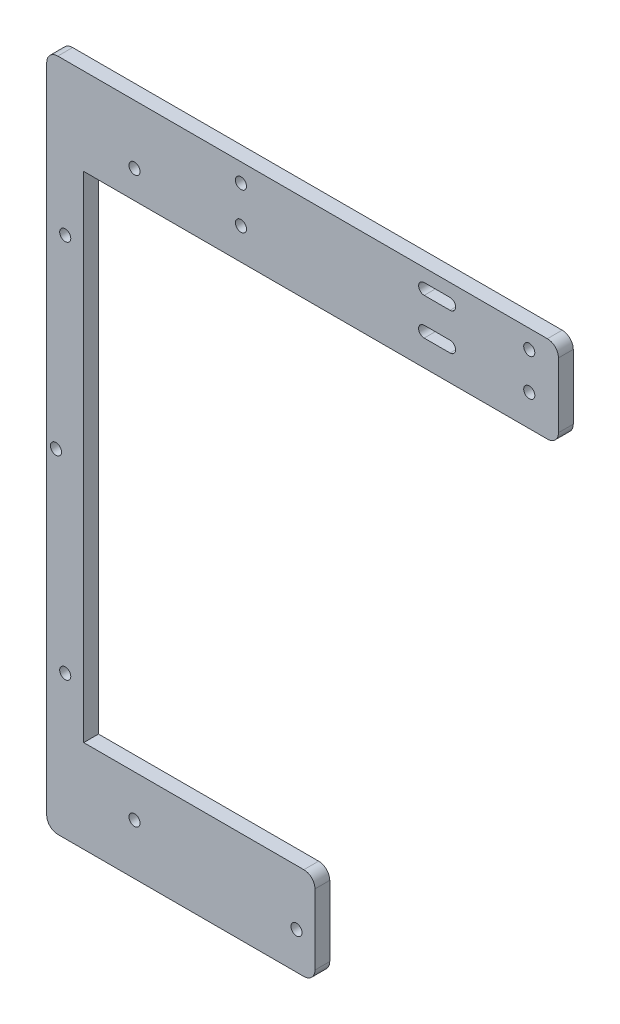
ISO-10303-21;
HEADER;
FILE_DESCRIPTION(('STEP AP214'),'2;1');
FILE_NAME('part.step','',(''),(''),'','','');
FILE_SCHEMA(('AUTOMOTIVE_DESIGN { 1 0 10303 214 1 1 1 1 }'));
ENDSEC;
DATA;
#1=APPLICATION_CONTEXT('core data for automotive mechanical design processes');
#2=APPLICATION_PROTOCOL_DEFINITION('international standard','automotive_design',2000,#1);
#3=PRODUCT_CONTEXT('',#1,'mechanical');
#4=PRODUCT('Part','Part','',(#3));
#5=PRODUCT_RELATED_PRODUCT_CATEGORY('part','',(#4));
#6=PRODUCT_DEFINITION_FORMATION('','',#4);
#7=PRODUCT_DEFINITION_CONTEXT('part definition',#1,'design');
#8=PRODUCT_DEFINITION('design','',#6,#7);
#9=PRODUCT_DEFINITION_SHAPE('','',#8);
#10=(LENGTH_UNIT() NAMED_UNIT(*) SI_UNIT(.MILLI.,.METRE.));
#11=(NAMED_UNIT(*) PLANE_ANGLE_UNIT() SI_UNIT($,.RADIAN.));
#12=(NAMED_UNIT(*) SI_UNIT($,.STERADIAN.) SOLID_ANGLE_UNIT());
#13=UNCERTAINTY_MEASURE_WITH_UNIT(LENGTH_MEASURE(1.E-05),#10,'distance_accuracy_value','');
#14=(GEOMETRIC_REPRESENTATION_CONTEXT(3) GLOBAL_UNCERTAINTY_ASSIGNED_CONTEXT((#13)) GLOBAL_UNIT_ASSIGNED_CONTEXT((#10,
#11,#12)) REPRESENTATION_CONTEXT('',''));
#15=CARTESIAN_POINT('',(0.,0.,0.));
#16=DIRECTION('',(0.,0.,1.));
#17=DIRECTION('',(1.,0.,0.));
#18=AXIS2_PLACEMENT_3D('',#15,#16,#17);
#19=CARTESIAN_POINT('',(18.6446855033038,119.732138716029,4.));
#20=DIRECTION('',(0.,0.,-1.));
#21=DIRECTION('',(-1.,0.,0.));
#22=AXIS2_PLACEMENT_3D('',#19,#20,#21);
#23=CYLINDRICAL_SURFACE('',#22,1.50000000000001);
#24=CARTESIAN_POINT('',(18.6446855033038,119.732138716029,0.));
#25=DIRECTION('',(0.,0.,1.));
#26=DIRECTION('',(1.,0.,0.));
#27=AXIS2_PLACEMENT_3D('',#24,#25,#26);
#28=CIRCLE('',#27,1.50000000000001);
#29=CARTESIAN_POINT('',(18.6446855033038,121.232138716029,0.));
#30=VERTEX_POINT('',#29);
#31=CARTESIAN_POINT('',(18.6446855033038,118.232138716029,0.));
#32=VERTEX_POINT('',#31);
#33=EDGE_CURVE('E379',#30,#32,#28,.T.);
#34=ORIENTED_EDGE('',*,*,#33,.F.);
#35=DIRECTION('',(0.,0.,-1.));
#36=VECTOR('',#35,1.);
#37=CARTESIAN_POINT('',(18.6446855033038,121.232138716029,4.));
#38=LINE('',#37,#36);
#39=CARTESIAN_POINT('',(18.6446855033038,121.232138716029,4.));
#40=VERTEX_POINT('',#39);
#41=EDGE_CURVE('E414',#40,#30,#38,.T.);
#42=ORIENTED_EDGE('',*,*,#41,.F.);
#43=CARTESIAN_POINT('',(18.6446855033038,119.732138716029,4.));
#44=DIRECTION('',(0.,0.,1.));
#45=DIRECTION('',(1.,0.,0.));
#46=AXIS2_PLACEMENT_3D('',#43,#44,#45);
#47=CIRCLE('',#46,1.50000000000001);
#48=CARTESIAN_POINT('',(18.6446855033038,118.232138716029,4.));
#49=VERTEX_POINT('',#48);
#50=EDGE_CURVE('E278',#40,#49,#47,.T.);
#51=ORIENTED_EDGE('',*,*,#50,.T.);
#52=DIRECTION('',(0.,0.,-1.));
#53=VECTOR('',#52,1.);
#54=CARTESIAN_POINT('',(18.6446855033038,118.232138716029,4.));
#55=LINE('',#54,#53);
#56=EDGE_CURVE('E404',#49,#32,#55,.T.);
#57=ORIENTED_EDGE('',*,*,#56,.T.);
#58=EDGE_LOOP('',(#34,#42,#51,#57));
#59=FACE_BOUND('',#58,.T.);
#60=ADVANCED_FACE('F47',(#59),#23,.F.);
#61=CARTESIAN_POINT('',(0.,121.232138716029,4.));
#62=DIRECTION('',(0.,-1.,0.));
#63=DIRECTION('',(0.,0.,-1.));
#64=AXIS2_PLACEMENT_3D('',#61,#62,#63);
#65=PLANE('',#64);
#66=DIRECTION('',(-1.,0.,0.));
#67=VECTOR('',#66,1.);
#68=CARTESIAN_POINT('',(0.,121.232138716029,0.));
#69=LINE('',#68,#67);
#70=CARTESIAN_POINT('',(25.6446855033038,121.232138716029,0.));
#71=VERTEX_POINT('',#70);
#72=EDGE_CURVE('E383',#71,#30,#69,.T.);
#73=ORIENTED_EDGE('',*,*,#72,.F.);
#74=DIRECTION('',(0.,0.,-1.));
#75=VECTOR('',#74,1.);
#76=CARTESIAN_POINT('',(25.6446855033038,121.232138716029,4.));
#77=LINE('',#76,#75);
#78=CARTESIAN_POINT('',(25.6446855033038,121.232138716029,4.));
#79=VERTEX_POINT('',#78);
#80=EDGE_CURVE('E411',#79,#71,#77,.T.);
#81=ORIENTED_EDGE('',*,*,#80,.F.);
#82=DIRECTION('',(-1.,0.,0.));
#83=VECTOR('',#82,1.);
#84=CARTESIAN_POINT('',(0.,121.232138716029,4.));
#85=LINE('',#84,#83);
#86=EDGE_CURVE('E282',#79,#40,#85,.T.);
#87=ORIENTED_EDGE('',*,*,#86,.T.);
#88=ORIENTED_EDGE('',*,*,#41,.T.);
#89=EDGE_LOOP('',(#73,#81,#87,#88));
#90=FACE_BOUND('',#89,.T.);
#91=ADVANCED_FACE('F558',(#90),#65,.T.);
#92=CARTESIAN_POINT('',(25.6446855033038,119.732138716029,4.));
#93=DIRECTION('',(0.,0.,-1.));
#94=DIRECTION('',(-1.,0.,0.));
#95=AXIS2_PLACEMENT_3D('',#92,#93,#94);
#96=CYLINDRICAL_SURFACE('',#95,1.5);
#97=CARTESIAN_POINT('',(25.6446855033038,119.732138716029,0.));
#98=DIRECTION('',(0.,0.,1.));
#99=DIRECTION('',(1.,0.,0.));
#100=AXIS2_PLACEMENT_3D('',#97,#98,#99);
#101=CIRCLE('',#100,1.5);
#102=CARTESIAN_POINT('',(25.6446855033038,118.232138716029,0.));
#103=VERTEX_POINT('',#102);
#104=EDGE_CURVE('E387',#103,#71,#101,.T.);
#105=ORIENTED_EDGE('',*,*,#104,.F.);
#106=DIRECTION('',(0.,0.,-1.));
#107=VECTOR('',#106,1.);
#108=CARTESIAN_POINT('',(25.6446855033038,118.232138716029,4.));
#109=LINE('',#108,#107);
#110=CARTESIAN_POINT('',(25.6446855033038,118.232138716029,4.));
#111=VERTEX_POINT('',#110);
#112=EDGE_CURVE('E407',#111,#103,#109,.T.);
#113=ORIENTED_EDGE('',*,*,#112,.F.);
#114=CARTESIAN_POINT('',(25.6446855033038,119.732138716029,4.));
#115=DIRECTION('',(0.,0.,1.));
#116=DIRECTION('',(1.,0.,0.));
#117=AXIS2_PLACEMENT_3D('',#114,#115,#116);
#118=CIRCLE('',#117,1.5);
#119=EDGE_CURVE('E286',#111,#79,#118,.T.);
#120=ORIENTED_EDGE('',*,*,#119,.T.);
#121=ORIENTED_EDGE('',*,*,#80,.T.);
#122=EDGE_LOOP('',(#105,#113,#120,#121));
#123=FACE_BOUND('',#122,.T.);
#124=ADVANCED_FACE('F564',(#123),#96,.F.);
#125=CARTESIAN_POINT('',(18.6446855033038,129.732138716029,4.));
#126=DIRECTION('',(0.,0.,-1.));
#127=DIRECTION('',(-1.,0.,0.));
#128=AXIS2_PLACEMENT_3D('',#125,#126,#127);
#129=CYLINDRICAL_SURFACE('',#128,1.5);
#130=CARTESIAN_POINT('',(18.6446855033038,129.732138716029,0.));
#131=DIRECTION('',(0.,0.,1.));
#132=DIRECTION('',(1.,0.,0.));
#133=AXIS2_PLACEMENT_3D('',#130,#131,#132);
#134=CIRCLE('',#133,1.5);
#135=CARTESIAN_POINT('',(18.6446855033038,131.232138716029,0.));
#136=VERTEX_POINT('',#135);
#137=CARTESIAN_POINT('',(18.6446855033038,128.232138716029,0.));
#138=VERTEX_POINT('',#137);
#139=EDGE_CURVE('E363',#136,#138,#134,.T.);
#140=ORIENTED_EDGE('',*,*,#139,.F.);
#141=DIRECTION('',(0.,0.,-1.));
#142=VECTOR('',#141,1.);
#143=CARTESIAN_POINT('',(18.6446855033038,131.232138716029,4.));
#144=LINE('',#143,#142);
#145=CARTESIAN_POINT('',(18.6446855033038,131.232138716029,4.));
#146=VERTEX_POINT('',#145);
#147=EDGE_CURVE('E408',#146,#136,#144,.T.);
#148=ORIENTED_EDGE('',*,*,#147,.F.);
#149=CARTESIAN_POINT('',(18.6446855033038,129.732138716029,4.));
#150=DIRECTION('',(0.,0.,1.));
#151=DIRECTION('',(1.,0.,0.));
#152=AXIS2_PLACEMENT_3D('',#149,#150,#151);
#153=CIRCLE('',#152,1.5);
#154=CARTESIAN_POINT('',(18.6446855033038,128.232138716029,4.));
#155=VERTEX_POINT('',#154);
#156=EDGE_CURVE('E262',#146,#155,#153,.T.);
#157=ORIENTED_EDGE('',*,*,#156,.T.);
#158=DIRECTION('',(0.,0.,-1.));
#159=VECTOR('',#158,1.);
#160=CARTESIAN_POINT('',(18.6446855033038,128.232138716029,4.));
#161=LINE('',#160,#159);
#162=EDGE_CURVE('E208',#155,#138,#161,.T.);
#163=ORIENTED_EDGE('',*,*,#162,.T.);
#164=EDGE_LOOP('',(#140,#148,#157,#163));
#165=FACE_BOUND('',#164,.T.);
#166=ADVANCED_FACE('F584',(#165),#129,.F.);
#167=CARTESIAN_POINT('',(0.,131.232138716029,4.));
#168=DIRECTION('',(0.,-1.,0.));
#169=DIRECTION('',(0.,0.,-1.));
#170=AXIS2_PLACEMENT_3D('',#167,#168,#169);
#171=PLANE('',#170);
#172=DIRECTION('',(-1.,0.,0.));
#173=VECTOR('',#172,1.);
#174=CARTESIAN_POINT('',(0.,131.232138716029,0.));
#175=LINE('',#174,#173);
#176=CARTESIAN_POINT('',(25.6446855033038,131.232138716029,0.));
#177=VERTEX_POINT('',#176);
#178=EDGE_CURVE('E367',#177,#136,#175,.T.);
#179=ORIENTED_EDGE('',*,*,#178,.F.);
#180=DIRECTION('',(0.,0.,-1.));
#181=VECTOR('',#180,1.);
#182=CARTESIAN_POINT('',(25.6446855033038,131.232138716029,4.));
#183=LINE('',#182,#181);
#184=CARTESIAN_POINT('',(25.6446855033038,131.232138716029,4.));
#185=VERTEX_POINT('',#184);
#186=EDGE_CURVE('E423',#185,#177,#183,.T.);
#187=ORIENTED_EDGE('',*,*,#186,.F.);
#188=DIRECTION('',(-1.,0.,0.));
#189=VECTOR('',#188,1.);
#190=CARTESIAN_POINT('',(0.,131.232138716029,4.));
#191=LINE('',#190,#189);
#192=EDGE_CURVE('E266',#185,#146,#191,.T.);
#193=ORIENTED_EDGE('',*,*,#192,.T.);
#194=ORIENTED_EDGE('',*,*,#147,.T.);
#195=EDGE_LOOP('',(#179,#187,#193,#194));
#196=FACE_BOUND('',#195,.T.);
#197=ADVANCED_FACE('F580',(#196),#171,.T.);
#198=CARTESIAN_POINT('',(25.6446855033038,129.732138716029,4.));
#199=DIRECTION('',(0.,0.,-1.));
#200=DIRECTION('',(-1.,0.,0.));
#201=AXIS2_PLACEMENT_3D('',#198,#199,#200);
#202=CYLINDRICAL_SURFACE('',#201,1.5);
#203=CARTESIAN_POINT('',(25.6446855033038,129.732138716029,0.));
#204=DIRECTION('',(0.,0.,1.));
#205=DIRECTION('',(1.,0.,0.));
#206=AXIS2_PLACEMENT_3D('',#203,#204,#205);
#207=CIRCLE('',#206,1.5);
#208=CARTESIAN_POINT('',(25.6446855033038,128.232138716029,0.));
#209=VERTEX_POINT('',#208);
#210=EDGE_CURVE('E371',#209,#177,#207,.T.);
#211=ORIENTED_EDGE('',*,*,#210,.F.);
#212=DIRECTION('',(0.,0.,-1.));
#213=VECTOR('',#212,1.);
#214=CARTESIAN_POINT('',(25.6446855033038,128.232138716029,4.));
#215=LINE('',#214,#213);
#216=CARTESIAN_POINT('',(25.6446855033038,128.232138716029,4.));
#217=VERTEX_POINT('',#216);
#218=EDGE_CURVE('E420',#217,#209,#215,.T.);
#219=ORIENTED_EDGE('',*,*,#218,.F.);
#220=CARTESIAN_POINT('',(25.6446855033038,129.732138716029,4.));
#221=DIRECTION('',(0.,0.,1.));
#222=DIRECTION('',(1.,0.,0.));
#223=AXIS2_PLACEMENT_3D('',#220,#221,#222);
#224=CIRCLE('',#223,1.5);
#225=EDGE_CURVE('E270',#217,#185,#224,.T.);
#226=ORIENTED_EDGE('',*,*,#225,.T.);
#227=ORIENTED_EDGE('',*,*,#186,.T.);
#228=EDGE_LOOP('',(#211,#219,#226,#227));
#229=FACE_BOUND('',#228,.T.);
#230=ADVANCED_FACE('F576',(#229),#202,.F.);
#231=CARTESIAN_POINT('',(0.,111.232138716029,4.));
#232=DIRECTION('',(0.,1.,0.));
#233=DIRECTION('',(0.,0.,1.));
#234=AXIS2_PLACEMENT_3D('',#231,#232,#233);
#235=PLANE('',#234);
#236=DIRECTION('',(1.,0.,0.));
#237=VECTOR('',#236,1.);
#238=CARTESIAN_POINT('',(0.,111.232138716029,0.));
#239=LINE('',#238,#237);
#240=CARTESIAN_POINT('',(-73.3753144967017,111.232138716029,0.));
#241=VERTEX_POINT('',#240);
#242=CARTESIAN_POINT('',(51.9446855033038,111.232138716029,0.));
#243=VERTEX_POINT('',#242);
#244=EDGE_CURVE('E302',#241,#243,#239,.T.);
#245=ORIENTED_EDGE('',*,*,#244,.T.);
#246=DIRECTION('',(0.,0.,-1.));
#247=VECTOR('',#246,1.);
#248=CARTESIAN_POINT('',(51.9446855033038,111.232138716029,4.));
#249=LINE('',#248,#247);
#250=CARTESIAN_POINT('',(51.9446855033038,111.232138716029,4.));
#251=VERTEX_POINT('',#250);
#252=EDGE_CURVE('E11',#243,#251,#249,.F.);
#253=ORIENTED_EDGE('',*,*,#252,.T.);
#254=DIRECTION('',(1.,0.,0.));
#255=VECTOR('',#254,1.);
#256=CARTESIAN_POINT('',(0.,111.232138716029,4.));
#257=LINE('',#256,#255);
#258=CARTESIAN_POINT('',(-73.3753144967017,111.232138716029,4.));
#259=VERTEX_POINT('',#258);
#260=EDGE_CURVE('E403',#259,#251,#257,.T.);
#261=ORIENTED_EDGE('',*,*,#260,.F.);
#262=DIRECTION('',(0.,0.,-1.));
#263=VECTOR('',#262,1.);
#264=CARTESIAN_POINT('',(-73.3753144967017,111.232138716029,4.));
#265=LINE('',#264,#263);
#266=EDGE_CURVE('E209',#259,#241,#265,.T.);
#267=ORIENTED_EDGE('',*,*,#266,.T.);
#268=EDGE_LOOP('',(#245,#253,#261,#267));
#269=FACE_BOUND('',#268,.T.);
#270=ADVANCED_FACE('F579',(#269),#235,.F.);
#271=CARTESIAN_POINT('',(54.9446855033038,0.,4.));
#272=DIRECTION('',(1.,0.,0.));
#273=DIRECTION('',(0.,0.,-1.));
#274=AXIS2_PLACEMENT_3D('',#271,#272,#273);
#275=PLANE('',#274);
#276=DIRECTION('',(0.,-1.,0.));
#277=VECTOR('',#276,1.);
#278=CARTESIAN_POINT('',(54.9446855033038,0.,4.));
#279=LINE('',#278,#277);
#280=CARTESIAN_POINT('',(54.9446855033038,131.732138716025,4.));
#281=VERTEX_POINT('',#280);
#282=CARTESIAN_POINT('',(54.9446855033038,114.232138716029,4.));
#283=VERTEX_POINT('',#282);
#284=EDGE_CURVE('E505',#281,#283,#279,.T.);
#285=ORIENTED_EDGE('',*,*,#284,.T.);
#286=DIRECTION('',(0.,0.,-1.));
#287=VECTOR('',#286,1.);
#288=CARTESIAN_POINT('',(54.9446855033038,114.232138716029,0.));
#289=LINE('',#288,#287);
#290=CARTESIAN_POINT('',(54.9446855033038,114.232138716029,0.));
#291=VERTEX_POINT('',#290);
#292=EDGE_CURVE('E56',#283,#291,#289,.T.);
#293=ORIENTED_EDGE('',*,*,#292,.T.);
#294=DIRECTION('',(0.,-1.,0.));
#295=VECTOR('',#294,1.);
#296=CARTESIAN_POINT('',(54.9446855033038,0.,0.));
#297=LINE('',#296,#295);
#298=CARTESIAN_POINT('',(54.9446855033038,131.732138716025,0.));
#299=VERTEX_POINT('',#298);
#300=EDGE_CURVE('E306',#299,#291,#297,.T.);
#301=ORIENTED_EDGE('',*,*,#300,.F.);
#302=DIRECTION('',(0.,0.,-1.));
#303=VECTOR('',#302,1.);
#304=CARTESIAN_POINT('',(54.9446855033038,131.732138716025,4.));
#305=LINE('',#304,#303);
#306=EDGE_CURVE('E494',#299,#281,#305,.F.);
#307=ORIENTED_EDGE('',*,*,#306,.T.);
#308=EDGE_LOOP('',(#285,#293,#301,#307));
#309=FACE_BOUND('',#308,.T.);
#310=ADVANCED_FACE('F502',(#309),#275,.T.);
#311=CARTESIAN_POINT('',(0.,134.732138716025,4.));
#312=DIRECTION('',(0.,1.,0.));
#313=DIRECTION('',(-1.,0.,0.));
#314=AXIS2_PLACEMENT_3D('',#311,#312,#313);
#315=PLANE('',#314);
#316=DIRECTION('',(1.,0.,0.));
#317=VECTOR('',#316,1.);
#318=CARTESIAN_POINT('',(0.,134.732138716025,0.));
#319=LINE('',#318,#317);
#320=CARTESIAN_POINT('',(-80.3753144967017,134.732138716025,0.));
#321=VERTEX_POINT('',#320);
#322=CARTESIAN_POINT('',(51.9446855033038,134.732138716025,0.));
#323=VERTEX_POINT('',#322);
#324=EDGE_CURVE('E310',#321,#323,#319,.T.);
#325=ORIENTED_EDGE('',*,*,#324,.F.);
#326=DIRECTION('',(0.,0.,-1.));
#327=VECTOR('',#326,1.);
#328=CARTESIAN_POINT('',(-80.3753144967017,134.732138716025,4.));
#329=LINE('',#328,#327);
#330=CARTESIAN_POINT('',(-80.3753144967017,134.732138716025,4.));
#331=VERTEX_POINT('',#330);
#332=EDGE_CURVE('E458',#321,#331,#329,.F.);
#333=ORIENTED_EDGE('',*,*,#332,.T.);
#334=DIRECTION('',(1.,0.,0.));
#335=VECTOR('',#334,1.);
#336=CARTESIAN_POINT('',(0.,134.732138716025,4.));
#337=LINE('',#336,#335);
#338=CARTESIAN_POINT('',(51.9446855033038,134.732138716025,4.));
#339=VERTEX_POINT('',#338);
#340=EDGE_CURVE('E521',#331,#339,#337,.T.);
#341=ORIENTED_EDGE('',*,*,#340,.T.);
#342=DIRECTION('',(0.,0.,-1.));
#343=VECTOR('',#342,1.);
#344=CARTESIAN_POINT('',(51.9446855033038,134.732138716025,4.));
#345=LINE('',#344,#343);
#346=EDGE_CURVE('E454',#339,#323,#345,.T.);
#347=ORIENTED_EDGE('',*,*,#346,.T.);
#348=EDGE_LOOP('',(#325,#333,#341,#347));
#349=FACE_BOUND('',#348,.T.);
#350=ADVANCED_FACE('F519',(#349),#315,.T.);
#351=CARTESIAN_POINT('',(-83.3753144967017,0.,4.));
#352=DIRECTION('',(1.,0.,0.));
#353=DIRECTION('',(0.,1.,0.));
#354=AXIS2_PLACEMENT_3D('',#351,#352,#353);
#355=PLANE('',#354);
#356=DIRECTION('',(0.,-1.,0.));
#357=VECTOR('',#356,1.);
#358=CARTESIAN_POINT('',(-83.3753144967017,0.,4.));
#359=LINE('',#358,#357);
#360=CARTESIAN_POINT('',(-83.3753144967018,131.732138716025,4.));
#361=VERTEX_POINT('',#360);
#362=CARTESIAN_POINT('',(-83.3753144967017,-44.4678612839723,4.));
#363=VERTEX_POINT('',#362);
#364=EDGE_CURVE('E524',#361,#363,#359,.T.);
#365=ORIENTED_EDGE('',*,*,#364,.F.);
#366=DIRECTION('',(0.,0.,-1.));
#367=VECTOR('',#366,1.);
#368=CARTESIAN_POINT('',(-83.3753144967018,131.732138716025,0.));
#369=LINE('',#368,#367);
#370=CARTESIAN_POINT('',(-83.3753144967018,131.732138716025,0.));
#371=VERTEX_POINT('',#370);
#372=EDGE_CURVE('E432',#361,#371,#369,.T.);
#373=ORIENTED_EDGE('',*,*,#372,.T.);
#374=DIRECTION('',(0.,-1.,0.));
#375=VECTOR('',#374,1.);
#376=CARTESIAN_POINT('',(-83.3753144967017,0.,0.));
#377=LINE('',#376,#375);
#378=CARTESIAN_POINT('',(-83.3753144967017,-44.4678612839723,0.));
#379=VERTEX_POINT('',#378);
#380=EDGE_CURVE('E314',#371,#379,#377,.T.);
#381=ORIENTED_EDGE('',*,*,#380,.T.);
#382=DIRECTION('',(0.,0.,-1.));
#383=VECTOR('',#382,1.);
#384=CARTESIAN_POINT('',(-83.3753144967017,-44.4678612839723,4.));
#385=LINE('',#384,#383);
#386=EDGE_CURVE('E417',#379,#363,#385,.F.);
#387=ORIENTED_EDGE('',*,*,#386,.T.);
#388=EDGE_LOOP('',(#365,#373,#381,#387));
#389=FACE_BOUND('',#388,.T.);
#390=ADVANCED_FACE('F631',(#389),#355,.F.);
#391=CARTESIAN_POINT('',(0.,-47.4678612839723,4.));
#392=DIRECTION('',(0.,1.,0.));
#393=DIRECTION('',(0.,0.,1.));
#394=AXIS2_PLACEMENT_3D('',#391,#392,#393);
#395=PLANE('',#394);
#396=DIRECTION('',(1.,0.,0.));
#397=VECTOR('',#396,1.);
#398=CARTESIAN_POINT('',(0.,-47.4678612839723,4.));
#399=LINE('',#398,#397);
#400=CARTESIAN_POINT('',(-80.3753144967017,-47.4678612839723,4.));
#401=VERTEX_POINT('',#400);
#402=CARTESIAN_POINT('',(-13.8753144967018,-47.4678612839723,4.));
#403=VERTEX_POINT('',#402);
#404=EDGE_CURVE('E227',#401,#403,#399,.T.);
#405=ORIENTED_EDGE('',*,*,#404,.F.);
#406=DIRECTION('',(0.,0.,-1.));
#407=VECTOR('',#406,1.);
#408=CARTESIAN_POINT('',(-80.3753144967017,-47.4678612839723,4.));
#409=LINE('',#408,#407);
#410=CARTESIAN_POINT('',(-80.3753144967017,-47.4678612839723,0.));
#411=VERTEX_POINT('',#410);
#412=EDGE_CURVE('E480',#401,#411,#409,.T.);
#413=ORIENTED_EDGE('',*,*,#412,.T.);
#414=DIRECTION('',(1.,0.,0.));
#415=VECTOR('',#414,1.);
#416=CARTESIAN_POINT('',(0.,-47.4678612839723,0.));
#417=LINE('',#416,#415);
#418=CARTESIAN_POINT('',(-13.8753144967018,-47.4678612839723,0.));
#419=VERTEX_POINT('',#418);
#420=EDGE_CURVE('E318',#411,#419,#417,.T.);
#421=ORIENTED_EDGE('',*,*,#420,.T.);
#422=DIRECTION('',(0.,0.,-1.));
#423=VECTOR('',#422,1.);
#424=CARTESIAN_POINT('',(-13.8753144967018,-47.4678612839723,4.));
#425=LINE('',#424,#423);
#426=EDGE_CURVE('E477',#419,#403,#425,.F.);
#427=ORIENTED_EDGE('',*,*,#426,.T.);
#428=EDGE_LOOP('',(#405,#413,#421,#427));
#429=FACE_BOUND('',#428,.T.);
#430=ADVANCED_FACE('F628',(#429),#395,.F.);
#431=CARTESIAN_POINT('',(-10.8753144967018,0.,4.));
#432=DIRECTION('',(1.,0.,0.));
#433=DIRECTION('',(0.,1.,0.));
#434=AXIS2_PLACEMENT_3D('',#431,#432,#433);
#435=PLANE('',#434);
#436=DIRECTION('',(0.,-1.,0.));
#437=VECTOR('',#436,1.);
#438=CARTESIAN_POINT('',(-10.8753144967018,0.,4.));
#439=LINE('',#438,#437);
#440=CARTESIAN_POINT('',(-10.8753144967018,-25.4678612839723,4.));
#441=VERTEX_POINT('',#440);
#442=CARTESIAN_POINT('',(-10.8753144967018,-44.4678612839723,4.));
#443=VERTEX_POINT('',#442);
#444=EDGE_CURVE('E224',#441,#443,#439,.T.);
#445=ORIENTED_EDGE('',*,*,#444,.T.);
#446=DIRECTION('',(0.,0.,-1.));
#447=VECTOR('',#446,1.);
#448=CARTESIAN_POINT('',(-10.8753144967018,-44.4678612839723,0.));
#449=LINE('',#448,#447);
#450=CARTESIAN_POINT('',(-10.8753144967018,-44.4678612839723,0.));
#451=VERTEX_POINT('',#450);
#452=EDGE_CURVE('E487',#443,#451,#449,.T.);
#453=ORIENTED_EDGE('',*,*,#452,.T.);
#454=DIRECTION('',(0.,-1.,0.));
#455=VECTOR('',#454,1.);
#456=CARTESIAN_POINT('',(-10.8753144967018,0.,0.));
#457=LINE('',#456,#455);
#458=CARTESIAN_POINT('',(-10.8753144967018,-25.4678612839723,0.));
#459=VERTEX_POINT('',#458);
#460=EDGE_CURVE('E322',#459,#451,#457,.T.);
#461=ORIENTED_EDGE('',*,*,#460,.F.);
#462=DIRECTION('',(0.,0.,-1.));
#463=VECTOR('',#462,1.);
#464=CARTESIAN_POINT('',(-10.8753144967018,-25.4678612839723,4.));
#465=LINE('',#464,#463);
#466=EDGE_CURVE('E484',#459,#441,#465,.F.);
#467=ORIENTED_EDGE('',*,*,#466,.T.);
#468=EDGE_LOOP('',(#445,#453,#461,#467));
#469=FACE_BOUND('',#468,.T.);
#470=ADVANCED_FACE('F543',(#469),#435,.T.);
#471=CARTESIAN_POINT('',(0.,-22.4678612839723,4.));
#472=DIRECTION('',(0.,1.,0.));
#473=DIRECTION('',(0.,0.,1.));
#474=AXIS2_PLACEMENT_3D('',#471,#472,#473);
#475=PLANE('',#474);
#476=DIRECTION('',(1.,0.,0.));
#477=VECTOR('',#476,1.);
#478=CARTESIAN_POINT('',(0.,-22.4678612839723,4.));
#479=LINE('',#478,#477);
#480=CARTESIAN_POINT('',(-73.3753144967017,-22.4678612839723,4.));
#481=VERTEX_POINT('',#480);
#482=CARTESIAN_POINT('',(-13.8753144967018,-22.4678612839723,4.));
#483=VERTEX_POINT('',#482);
#484=EDGE_CURVE('E201',#481,#483,#479,.T.);
#485=ORIENTED_EDGE('',*,*,#484,.T.);
#486=DIRECTION('',(0.,0.,-1.));
#487=VECTOR('',#486,1.);
#488=CARTESIAN_POINT('',(-13.8753144967018,-22.4678612839723,4.));
#489=LINE('',#488,#487);
#490=CARTESIAN_POINT('',(-13.8753144967018,-22.4678612839723,0.));
#491=VERTEX_POINT('',#490);
#492=EDGE_CURVE('E491',#483,#491,#489,.T.);
#493=ORIENTED_EDGE('',*,*,#492,.T.);
#494=DIRECTION('',(1.,0.,0.));
#495=VECTOR('',#494,1.);
#496=CARTESIAN_POINT('',(0.,-22.4678612839723,0.));
#497=LINE('',#496,#495);
#498=CARTESIAN_POINT('',(-73.3753144967017,-22.4678612839723,0.));
#499=VERTEX_POINT('',#498);
#500=EDGE_CURVE('E204',#499,#491,#497,.T.);
#501=ORIENTED_EDGE('',*,*,#500,.F.);
#502=DIRECTION('',(0.,0.,-1.));
#503=VECTOR('',#502,1.);
#504=CARTESIAN_POINT('',(-73.3753144967017,-22.4678612839723,4.));
#505=LINE('',#504,#503);
#506=EDGE_CURVE('E197',#481,#499,#505,.T.);
#507=ORIENTED_EDGE('',*,*,#506,.F.);
#508=EDGE_LOOP('',(#485,#493,#501,#507));
#509=FACE_BOUND('',#508,.T.);
#510=ADVANCED_FACE('F199',(#509),#475,.T.);
#511=CARTESIAN_POINT('',(47.0446855033087,129.732138716025,4.));
#512=DIRECTION('',(0.,0.,-1.));
#513=DIRECTION('',(-1.,0.,0.));
#514=AXIS2_PLACEMENT_3D('',#511,#512,#513);
#515=CYLINDRICAL_SURFACE('',#514,1.5);
#516=CARTESIAN_POINT('',(47.0446855033087,129.732138716025,4.));
#517=DIRECTION('',(0.,0.,1.));
#518=DIRECTION('',(1.,0.,0.));
#519=AXIS2_PLACEMENT_3D('',#516,#517,#518);
#520=CIRCLE('',#519,1.5);
#521=CARTESIAN_POINT('',(48.5446855033087,129.732138716025,4.));
#522=VERTEX_POINT('',#521);
#523=EDGE_CURVE('E294',#522,#522,#520,.T.);
#524=ORIENTED_EDGE('',*,*,#523,.T.);
#525=EDGE_LOOP('',(#524));
#526=FACE_BOUND('',#525,.T.);
#527=CARTESIAN_POINT('',(47.0446855033087,129.732138716025,0.));
#528=DIRECTION('',(0.,0.,1.));
#529=DIRECTION('',(1.,0.,0.));
#530=AXIS2_PLACEMENT_3D('',#527,#528,#529);
#531=CIRCLE('',#530,1.5);
#532=CARTESIAN_POINT('',(48.5446855033087,129.732138716025,0.));
#533=VERTEX_POINT('',#532);
#534=EDGE_CURVE('E395',#533,#533,#531,.T.);
#535=ORIENTED_EDGE('',*,*,#534,.F.);
#536=EDGE_LOOP('',(#535));
#537=FACE_BOUND('',#536,.T.);
#538=ADVANCED_FACE('F625',(#526,#537),#515,.F.);
#539=CARTESIAN_POINT('',(-2.34400076166448E-13,118.232138716029,4.));
#540=DIRECTION('',(0.,1.,0.));
#541=DIRECTION('',(-1.,0.,0.));
#542=AXIS2_PLACEMENT_3D('',#539,#540,#541);
#543=PLANE('',#542);
#544=DIRECTION('',(1.,0.,0.));
#545=VECTOR('',#544,1.);
#546=CARTESIAN_POINT('',(-2.34400076166448E-13,118.232138716029,0.));
#547=LINE('',#546,#545);
#548=EDGE_CURVE('E391',#32,#103,#547,.T.);
#549=ORIENTED_EDGE('',*,*,#548,.F.);
#550=ORIENTED_EDGE('',*,*,#56,.F.);
#551=DIRECTION('',(1.,0.,0.));
#552=VECTOR('',#551,1.);
#553=CARTESIAN_POINT('',(-2.34400076166448E-13,118.232138716029,4.));
#554=LINE('',#553,#552);
#555=EDGE_CURVE('E290',#49,#111,#554,.T.);
#556=ORIENTED_EDGE('',*,*,#555,.T.);
#557=ORIENTED_EDGE('',*,*,#112,.T.);
#558=EDGE_LOOP('',(#549,#550,#556,#557));
#559=FACE_BOUND('',#558,.T.);
#560=ADVANCED_FACE('F574',(#559),#543,.T.);
#561=CARTESIAN_POINT('',(0.,128.232138716029,4.));
#562=DIRECTION('',(0.,1.,0.));
#563=DIRECTION('',(0.,0.,1.));
#564=AXIS2_PLACEMENT_3D('',#561,#562,#563);
#565=PLANE('',#564);
#566=DIRECTION('',(1.,0.,0.));
#567=VECTOR('',#566,1.);
#568=CARTESIAN_POINT('',(0.,128.232138716029,0.));
#569=LINE('',#568,#567);
#570=EDGE_CURVE('E375',#138,#209,#569,.T.);
#571=ORIENTED_EDGE('',*,*,#570,.F.);
#572=ORIENTED_EDGE('',*,*,#162,.F.);
#573=DIRECTION('',(1.,0.,0.));
#574=VECTOR('',#573,1.);
#575=CARTESIAN_POINT('',(0.,128.232138716029,4.));
#576=LINE('',#575,#574);
#577=EDGE_CURVE('E274',#155,#217,#576,.T.);
#578=ORIENTED_EDGE('',*,*,#577,.T.);
#579=ORIENTED_EDGE('',*,*,#218,.T.);
#580=EDGE_LOOP('',(#571,#572,#578,#579));
#581=FACE_BOUND('',#580,.T.);
#582=ADVANCED_FACE('F570',(#581),#565,.T.);
#583=CARTESIAN_POINT('',(-15.8753144967018,-37.4678612839723,4.));
#584=DIRECTION('',(0.,0.,-1.));
#585=DIRECTION('',(-1.,0.,0.));
#586=AXIS2_PLACEMENT_3D('',#583,#584,#585);
#587=CYLINDRICAL_SURFACE('',#586,1.5);
#588=CARTESIAN_POINT('',(-15.8753144967018,-37.4678612839723,4.));
#589=DIRECTION('',(0.,0.,1.));
#590=DIRECTION('',(1.,0.,0.));
#591=AXIS2_PLACEMENT_3D('',#588,#589,#590);
#592=CIRCLE('',#591,1.5);
#593=CARTESIAN_POINT('',(-14.3753144967018,-37.4678612839723,4.));
#594=VERTEX_POINT('',#593);
#595=EDGE_CURVE('E258',#594,#594,#592,.T.);
#596=ORIENTED_EDGE('',*,*,#595,.T.);
#597=EDGE_LOOP('',(#596));
#598=FACE_BOUND('',#597,.T.);
#599=CARTESIAN_POINT('',(-15.8753144967018,-37.4678612839723,0.));
#600=DIRECTION('',(0.,0.,1.));
#601=DIRECTION('',(1.,0.,0.));
#602=AXIS2_PLACEMENT_3D('',#599,#600,#601);
#603=CIRCLE('',#602,1.5);
#604=CARTESIAN_POINT('',(-14.3753144967018,-37.4678612839723,0.));
#605=VERTEX_POINT('',#604);
#606=EDGE_CURVE('E359',#605,#605,#603,.T.);
#607=ORIENTED_EDGE('',*,*,#606,.F.);
#608=EDGE_LOOP('',(#607));
#609=FACE_BOUND('',#608,.T.);
#610=ADVANCED_FACE('F573',(#598,#609),#587,.F.);
#611=CARTESIAN_POINT('',(-30.8753144967018,119.732138716025,4.));
#612=DIRECTION('',(0.,0.,-1.));
#613=DIRECTION('',(-1.,0.,0.));
#614=AXIS2_PLACEMENT_3D('',#611,#612,#613);
#615=CYLINDRICAL_SURFACE('',#614,1.5);
#616=CARTESIAN_POINT('',(-30.8753144967018,119.732138716025,4.));
#617=DIRECTION('',(0.,0.,1.));
#618=DIRECTION('',(1.,0.,0.));
#619=AXIS2_PLACEMENT_3D('',#616,#617,#618);
#620=CIRCLE('',#619,1.5);
#621=CARTESIAN_POINT('',(-29.3753144967018,119.732138716025,4.));
#622=VERTEX_POINT('',#621);
#623=EDGE_CURVE('E254',#622,#622,#620,.T.);
#624=ORIENTED_EDGE('',*,*,#623,.T.);
#625=EDGE_LOOP('',(#624));
#626=FACE_BOUND('',#625,.T.);
#627=CARTESIAN_POINT('',(-30.8753144967018,119.732138716025,0.));
#628=DIRECTION('',(0.,0.,1.));
#629=DIRECTION('',(1.,0.,0.));
#630=AXIS2_PLACEMENT_3D('',#627,#628,#629);
#631=CIRCLE('',#630,1.5);
#632=CARTESIAN_POINT('',(-29.3753144967018,119.732138716025,0.));
#633=VERTEX_POINT('',#632);
#634=EDGE_CURVE('E355',#633,#633,#631,.T.);
#635=ORIENTED_EDGE('',*,*,#634,.F.);
#636=EDGE_LOOP('',(#635));
#637=FACE_BOUND('',#636,.T.);
#638=ADVANCED_FACE('F591',(#626,#637),#615,.F.);
#639=CARTESIAN_POINT('',(-30.8753144967018,129.732138716021,4.));
#640=DIRECTION('',(0.,0.,-1.));
#641=DIRECTION('',(-1.,0.,0.));
#642=AXIS2_PLACEMENT_3D('',#639,#640,#641);
#643=CYLINDRICAL_SURFACE('',#642,1.5);
#644=CARTESIAN_POINT('',(-30.8753144967018,129.732138716021,4.));
#645=DIRECTION('',(0.,0.,1.));
#646=DIRECTION('',(1.,0.,0.));
#647=AXIS2_PLACEMENT_3D('',#644,#645,#646);
#648=CIRCLE('',#647,1.5);
#649=CARTESIAN_POINT('',(-29.3753144967018,129.732138716021,4.));
#650=VERTEX_POINT('',#649);
#651=EDGE_CURVE('E250',#650,#650,#648,.T.);
#652=ORIENTED_EDGE('',*,*,#651,.T.);
#653=EDGE_LOOP('',(#652));
#654=FACE_BOUND('',#653,.T.);
#655=CARTESIAN_POINT('',(-30.8753144967018,129.732138716021,0.));
#656=DIRECTION('',(0.,0.,1.));
#657=DIRECTION('',(1.,0.,0.));
#658=AXIS2_PLACEMENT_3D('',#655,#656,#657);
#659=CIRCLE('',#658,1.5);
#660=CARTESIAN_POINT('',(-29.3753144967018,129.732138716021,0.));
#661=VERTEX_POINT('',#660);
#662=EDGE_CURVE('E351',#661,#661,#659,.T.);
#663=ORIENTED_EDGE('',*,*,#662,.F.);
#664=EDGE_LOOP('',(#663));
#665=FACE_BOUND('',#664,.T.);
#666=ADVANCED_FACE('F595',(#654,#665),#643,.F.);
#667=CARTESIAN_POINT('',(-59.6453144967017,-33.7378612839723,4.));
#668=DIRECTION('',(0.,0.,-1.));
#669=DIRECTION('',(-1.,0.,0.));
#670=AXIS2_PLACEMENT_3D('',#667,#668,#669);
#671=CYLINDRICAL_SURFACE('',#670,1.5);
#672=CARTESIAN_POINT('',(-59.6453144967017,-33.7378612839723,4.));
#673=DIRECTION('',(0.,0.,1.));
#674=DIRECTION('',(1.,0.,0.));
#675=AXIS2_PLACEMENT_3D('',#672,#673,#674);
#676=CIRCLE('',#675,1.5);
#677=CARTESIAN_POINT('',(-58.1453144967017,-33.7378612839723,4.));
#678=VERTEX_POINT('',#677);
#679=EDGE_CURVE('E246',#678,#678,#676,.T.);
#680=ORIENTED_EDGE('',*,*,#679,.T.);
#681=EDGE_LOOP('',(#680));
#682=FACE_BOUND('',#681,.T.);
#683=CARTESIAN_POINT('',(-59.6453144967017,-33.7378612839723,0.));
#684=DIRECTION('',(0.,0.,1.));
#685=DIRECTION('',(1.,0.,0.));
#686=AXIS2_PLACEMENT_3D('',#683,#684,#685);
#687=CIRCLE('',#686,1.5);
#688=CARTESIAN_POINT('',(-58.1453144967017,-33.7378612839723,0.));
#689=VERTEX_POINT('',#688);
#690=EDGE_CURVE('E347',#689,#689,#687,.T.);
#691=ORIENTED_EDGE('',*,*,#690,.F.);
#692=EDGE_LOOP('',(#691));
#693=FACE_BOUND('',#692,.T.);
#694=ADVANCED_FACE('F599',(#682,#693),#671,.F.);
#695=CARTESIAN_POINT('',(-78.3753144967017,-8.7378612839723,4.));
#696=DIRECTION('',(0.,0.,-1.));
#697=DIRECTION('',(-1.,0.,0.));
#698=AXIS2_PLACEMENT_3D('',#695,#696,#697);
#699=CYLINDRICAL_SURFACE('',#698,1.5);
#700=CARTESIAN_POINT('',(-78.3753144967017,-8.7378612839723,4.));
#701=DIRECTION('',(0.,0.,1.));
#702=DIRECTION('',(1.,0.,0.));
#703=AXIS2_PLACEMENT_3D('',#700,#701,#702);
#704=CIRCLE('',#703,1.5);
#705=CARTESIAN_POINT('',(-76.8753144967017,-8.7378612839723,4.));
#706=VERTEX_POINT('',#705);
#707=EDGE_CURVE('E242',#706,#706,#704,.T.);
#708=ORIENTED_EDGE('',*,*,#707,.T.);
#709=EDGE_LOOP('',(#708));
#710=FACE_BOUND('',#709,.T.);
#711=CARTESIAN_POINT('',(-78.3753144967017,-8.7378612839723,0.));
#712=DIRECTION('',(0.,0.,1.));
#713=DIRECTION('',(1.,0.,0.));
#714=AXIS2_PLACEMENT_3D('',#711,#712,#713);
#715=CIRCLE('',#714,1.5);
#716=CARTESIAN_POINT('',(-76.8753144967017,-8.7378612839723,0.));
#717=VERTEX_POINT('',#716);
#718=EDGE_CURVE('E343',#717,#717,#715,.T.);
#719=ORIENTED_EDGE('',*,*,#718,.F.);
#720=EDGE_LOOP('',(#719));
#721=FACE_BOUND('',#720,.T.);
#722=ADVANCED_FACE('F603',(#710,#721),#699,.F.);
#723=CARTESIAN_POINT('',(-78.3753144967017,93.8021387160294,4.));
#724=DIRECTION('',(0.,0.,-1.));
#725=DIRECTION('',(-1.,0.,0.));
#726=AXIS2_PLACEMENT_3D('',#723,#724,#725);
#727=CYLINDRICAL_SURFACE('',#726,1.5);
#728=CARTESIAN_POINT('',(-78.3753144967017,93.8021387160294,4.));
#729=DIRECTION('',(0.,0.,1.));
#730=DIRECTION('',(1.,0.,0.));
#731=AXIS2_PLACEMENT_3D('',#728,#729,#730);
#732=CIRCLE('',#731,1.5);
#733=CARTESIAN_POINT('',(-76.8753144967017,93.8021387160294,4.));
#734=VERTEX_POINT('',#733);
#735=EDGE_CURVE('E238',#734,#734,#732,.T.);
#736=ORIENTED_EDGE('',*,*,#735,.T.);
#737=EDGE_LOOP('',(#736));
#738=FACE_BOUND('',#737,.T.);
#739=CARTESIAN_POINT('',(-78.3753144967017,93.8021387160294,0.));
#740=DIRECTION('',(0.,0.,1.));
#741=DIRECTION('',(1.,0.,0.));
#742=AXIS2_PLACEMENT_3D('',#739,#740,#741);
#743=CIRCLE('',#742,1.5);
#744=CARTESIAN_POINT('',(-76.8753144967017,93.8021387160294,0.));
#745=VERTEX_POINT('',#744);
#746=EDGE_CURVE('E339',#745,#745,#743,.T.);
#747=ORIENTED_EDGE('',*,*,#746,.F.);
#748=EDGE_LOOP('',(#747));
#749=FACE_BOUND('',#748,.T.);
#750=ADVANCED_FACE('F607',(#738,#749),#727,.F.);
#751=CARTESIAN_POINT('',(-59.6453144967017,118.802138716029,4.));
#752=DIRECTION('',(0.,0.,-1.));
#753=DIRECTION('',(-1.,0.,0.));
#754=AXIS2_PLACEMENT_3D('',#751,#752,#753);
#755=CYLINDRICAL_SURFACE('',#754,1.5);
#756=CARTESIAN_POINT('',(-59.6453144967017,118.802138716029,4.));
#757=DIRECTION('',(0.,0.,1.));
#758=DIRECTION('',(1.,0.,0.));
#759=AXIS2_PLACEMENT_3D('',#756,#757,#758);
#760=CIRCLE('',#759,1.5);
#761=CARTESIAN_POINT('',(-58.1453144967017,118.802138716029,4.));
#762=VERTEX_POINT('',#761);
#763=EDGE_CURVE('E234',#762,#762,#760,.T.);
#764=ORIENTED_EDGE('',*,*,#763,.T.);
#765=EDGE_LOOP('',(#764));
#766=FACE_BOUND('',#765,.T.);
#767=CARTESIAN_POINT('',(-59.6453144967017,118.802138716029,0.));
#768=DIRECTION('',(0.,0.,1.));
#769=DIRECTION('',(1.,0.,0.));
#770=AXIS2_PLACEMENT_3D('',#767,#768,#769);
#771=CIRCLE('',#770,1.5);
#772=CARTESIAN_POINT('',(-58.1453144967017,118.802138716029,0.));
#773=VERTEX_POINT('',#772);
#774=EDGE_CURVE('E335',#773,#773,#771,.T.);
#775=ORIENTED_EDGE('',*,*,#774,.F.);
#776=EDGE_LOOP('',(#775));
#777=FACE_BOUND('',#776,.T.);
#778=ADVANCED_FACE('F611',(#766,#777),#755,.F.);
#779=CARTESIAN_POINT('',(-80.8753144967017,42.5321387160277,4.));
#780=DIRECTION('',(0.,0.,-1.));
#781=DIRECTION('',(-1.,0.,0.));
#782=AXIS2_PLACEMENT_3D('',#779,#780,#781);
#783=CYLINDRICAL_SURFACE('',#782,1.5);
#784=CARTESIAN_POINT('',(-80.8753144967017,42.5321387160277,4.));
#785=DIRECTION('',(0.,0.,1.));
#786=DIRECTION('',(1.,0.,0.));
#787=AXIS2_PLACEMENT_3D('',#784,#785,#786);
#788=CIRCLE('',#787,1.5);
#789=CARTESIAN_POINT('',(-79.3753144967017,42.5321387160277,4.));
#790=VERTEX_POINT('',#789);
#791=EDGE_CURVE('E218',#790,#790,#788,.T.);
#792=ORIENTED_EDGE('',*,*,#791,.T.);
#793=EDGE_LOOP('',(#792));
#794=FACE_BOUND('',#793,.T.);
#795=CARTESIAN_POINT('',(-80.8753144967017,42.5321387160277,0.));
#796=DIRECTION('',(0.,0.,1.));
#797=DIRECTION('',(1.,0.,0.));
#798=AXIS2_PLACEMENT_3D('',#795,#796,#797);
#799=CIRCLE('',#798,1.5);
#800=CARTESIAN_POINT('',(-79.3753144967017,42.5321387160277,0.));
#801=VERTEX_POINT('',#800);
#802=EDGE_CURVE('E331',#801,#801,#799,.T.);
#803=ORIENTED_EDGE('',*,*,#802,.F.);
#804=EDGE_LOOP('',(#803));
#805=FACE_BOUND('',#804,.T.);
#806=ADVANCED_FACE('F615',(#794,#805),#783,.F.);
#807=CARTESIAN_POINT('',(-73.3753144967017,0.,4.));
#808=DIRECTION('',(-1.,0.,0.));
#809=DIRECTION('',(0.,0.,1.));
#810=AXIS2_PLACEMENT_3D('',#807,#808,#809);
#811=PLANE('',#810);
#812=DIRECTION('',(0.,1.,0.));
#813=VECTOR('',#812,1.);
#814=CARTESIAN_POINT('',(-73.3753144967017,0.,0.));
#815=LINE('',#814,#813);
#816=EDGE_CURVE('E328',#499,#241,#815,.T.);
#817=ORIENTED_EDGE('',*,*,#816,.T.);
#818=ORIENTED_EDGE('',*,*,#266,.F.);
#819=DIRECTION('',(0.,1.,0.));
#820=VECTOR('',#819,1.);
#821=CARTESIAN_POINT('',(-73.3753144967017,0.,4.));
#822=LINE('',#821,#820);
#823=EDGE_CURVE('E212',#481,#259,#822,.T.);
#824=ORIENTED_EDGE('',*,*,#823,.F.);
#825=ORIENTED_EDGE('',*,*,#506,.T.);
#826=EDGE_LOOP('',(#817,#818,#824,#825));
#827=FACE_BOUND('',#826,.T.);
#828=ADVANCED_FACE('F213',(#827),#811,.F.);
#829=CARTESIAN_POINT('',(47.0446855033087,119.732138716025,4.));
#830=DIRECTION('',(0.,0.,-1.));
#831=DIRECTION('',(-1.,0.,0.));
#832=AXIS2_PLACEMENT_3D('',#829,#830,#831);
#833=CYLINDRICAL_SURFACE('',#832,1.5);
#834=CARTESIAN_POINT('',(47.0446855033087,119.732138716025,4.));
#835=DIRECTION('',(0.,0.,1.));
#836=DIRECTION('',(1.,0.,0.));
#837=AXIS2_PLACEMENT_3D('',#834,#835,#836);
#838=CIRCLE('',#837,1.5);
#839=CARTESIAN_POINT('',(48.5446855033087,119.732138716025,4.));
#840=VERTEX_POINT('',#839);
#841=EDGE_CURVE('E298',#840,#840,#838,.T.);
#842=ORIENTED_EDGE('',*,*,#841,.T.);
#843=EDGE_LOOP('',(#842));
#844=FACE_BOUND('',#843,.T.);
#845=CARTESIAN_POINT('',(47.0446855033087,119.732138716025,0.));
#846=DIRECTION('',(0.,0.,1.));
#847=DIRECTION('',(1.,0.,0.));
#848=AXIS2_PLACEMENT_3D('',#845,#846,#847);
#849=CIRCLE('',#848,1.5);
#850=CARTESIAN_POINT('',(48.5446855033087,119.732138716025,0.));
#851=VERTEX_POINT('',#850);
#852=EDGE_CURVE('E399',#851,#851,#849,.T.);
#853=ORIENTED_EDGE('',*,*,#852,.F.);
#854=EDGE_LOOP('',(#853));
#855=FACE_BOUND('',#854,.T.);
#856=ADVANCED_FACE('F622',(#844,#855),#833,.F.);
#857=CARTESIAN_POINT('',(0.,0.,4.));
#858=DIRECTION('',(0.,0.,1.));
#859=DIRECTION('',(1.,0.,0.));
#860=AXIS2_PLACEMENT_3D('',#857,#858,#859);
#861=PLANE('',#860);
#862=ORIENTED_EDGE('',*,*,#340,.F.);
#863=CARTESIAN_POINT('',(-80.3753144967017,131.732138716025,4.));
#864=DIRECTION('',(0.,0.,1.));
#865=DIRECTION('',(1.,0.,0.));
#866=AXIS2_PLACEMENT_3D('',#863,#864,#865);
#867=CIRCLE('',#866,3.);
#868=EDGE_CURVE('E474',#331,#361,#867,.T.);
#869=ORIENTED_EDGE('',*,*,#868,.T.);
#870=ORIENTED_EDGE('',*,*,#364,.T.);
#871=CARTESIAN_POINT('',(-80.3753144967017,-44.4678612839723,4.));
#872=DIRECTION('',(0.,0.,1.));
#873=DIRECTION('',(1.,0.,0.));
#874=AXIS2_PLACEMENT_3D('',#871,#872,#873);
#875=CIRCLE('',#874,3.);
#876=EDGE_CURVE('E471',#363,#401,#875,.T.);
#877=ORIENTED_EDGE('',*,*,#876,.T.);
#878=ORIENTED_EDGE('',*,*,#404,.T.);
#879=CARTESIAN_POINT('',(-13.8753144967018,-44.4678612839723,4.));
#880=DIRECTION('',(0.,0.,1.));
#881=DIRECTION('',(1.,0.,0.));
#882=AXIS2_PLACEMENT_3D('',#879,#880,#881);
#883=CIRCLE('',#882,3.);
#884=EDGE_CURVE('E69',#403,#443,#883,.T.);
#885=ORIENTED_EDGE('',*,*,#884,.T.);
#886=ORIENTED_EDGE('',*,*,#444,.F.);
#887=CARTESIAN_POINT('',(-13.8753144967018,-25.4678612839723,4.));
#888=DIRECTION('',(0.,0.,1.));
#889=DIRECTION('',(1.,0.,0.));
#890=AXIS2_PLACEMENT_3D('',#887,#888,#889);
#891=CIRCLE('',#890,3.);
#892=EDGE_CURVE('E63',#441,#483,#891,.T.);
#893=ORIENTED_EDGE('',*,*,#892,.T.);
#894=ORIENTED_EDGE('',*,*,#484,.F.);
#895=ORIENTED_EDGE('',*,*,#823,.T.);
#896=ORIENTED_EDGE('',*,*,#260,.T.);
#897=CARTESIAN_POINT('',(51.9446855033038,114.232138716029,4.));
#898=DIRECTION('',(0.,0.,1.));
#899=DIRECTION('',(1.,0.,0.));
#900=AXIS2_PLACEMENT_3D('',#897,#898,#899);
#901=CIRCLE('',#900,3.);
#902=EDGE_CURVE('E464',#251,#283,#901,.T.);
#903=ORIENTED_EDGE('',*,*,#902,.T.);
#904=ORIENTED_EDGE('',*,*,#284,.F.);
#905=CARTESIAN_POINT('',(51.9446855033038,131.732138716025,4.));
#906=DIRECTION('',(0.,0.,1.));
#907=DIRECTION('',(1.,0.,0.));
#908=AXIS2_PLACEMENT_3D('',#905,#906,#907);
#909=CIRCLE('',#908,3.);
#910=EDGE_CURVE('E461',#281,#339,#909,.T.);
#911=ORIENTED_EDGE('',*,*,#910,.T.);
#912=EDGE_LOOP('',(#862,#869,#870,#877,#878,#885,#886,#893,#894,#895,#896,#903,#904,#911));
#913=FACE_BOUND('',#912,.T.);
#914=ORIENTED_EDGE('',*,*,#791,.F.);
#915=EDGE_LOOP('',(#914));
#916=FACE_BOUND('',#915,.T.);
#917=ORIENTED_EDGE('',*,*,#763,.F.);
#918=EDGE_LOOP('',(#917));
#919=FACE_BOUND('',#918,.T.);
#920=ORIENTED_EDGE('',*,*,#735,.F.);
#921=EDGE_LOOP('',(#920));
#922=FACE_BOUND('',#921,.T.);
#923=ORIENTED_EDGE('',*,*,#707,.F.);
#924=EDGE_LOOP('',(#923));
#925=FACE_BOUND('',#924,.T.);
#926=ORIENTED_EDGE('',*,*,#679,.F.);
#927=EDGE_LOOP('',(#926));
#928=FACE_BOUND('',#927,.T.);
#929=ORIENTED_EDGE('',*,*,#651,.F.);
#930=EDGE_LOOP('',(#929));
#931=FACE_BOUND('',#930,.T.);
#932=ORIENTED_EDGE('',*,*,#623,.F.);
#933=EDGE_LOOP('',(#932));
#934=FACE_BOUND('',#933,.T.);
#935=ORIENTED_EDGE('',*,*,#595,.F.);
#936=EDGE_LOOP('',(#935));
#937=FACE_BOUND('',#936,.T.);
#938=ORIENTED_EDGE('',*,*,#156,.F.);
#939=ORIENTED_EDGE('',*,*,#192,.F.);
#940=ORIENTED_EDGE('',*,*,#225,.F.);
#941=ORIENTED_EDGE('',*,*,#577,.F.);
#942=EDGE_LOOP('',(#938,#939,#940,#941));
#943=FACE_BOUND('',#942,.T.);
#944=ORIENTED_EDGE('',*,*,#50,.F.);
#945=ORIENTED_EDGE('',*,*,#86,.F.);
#946=ORIENTED_EDGE('',*,*,#119,.F.);
#947=ORIENTED_EDGE('',*,*,#555,.F.);
#948=EDGE_LOOP('',(#944,#945,#946,#947));
#949=FACE_BOUND('',#948,.T.);
#950=ORIENTED_EDGE('',*,*,#523,.F.);
#951=EDGE_LOOP('',(#950));
#952=FACE_BOUND('',#951,.T.);
#953=ORIENTED_EDGE('',*,*,#841,.F.);
#954=EDGE_LOOP('',(#953));
#955=FACE_BOUND('',#954,.T.);
#956=ADVANCED_FACE('F221',(#913,#916,#919,#922,#925,#928,#931,#934,#937,#943,#949,#952,#955),
#861,.T.);
#957=CARTESIAN_POINT('',(0.,0.,0.));
#958=DIRECTION('',(0.,0.,1.));
#959=DIRECTION('',(1.,0.,0.));
#960=AXIS2_PLACEMENT_3D('',#957,#958,#959);
#961=PLANE('',#960);
#962=ORIENTED_EDGE('',*,*,#380,.F.);
#963=CARTESIAN_POINT('',(-80.3753144967017,131.732138716025,0.));
#964=DIRECTION('',(0.,0.,1.));
#965=DIRECTION('',(1.,0.,0.));
#966=AXIS2_PLACEMENT_3D('',#963,#964,#965);
#967=CIRCLE('',#966,3.);
#968=EDGE_CURVE('E451',#371,#321,#967,.F.);
#969=ORIENTED_EDGE('',*,*,#968,.T.);
#970=ORIENTED_EDGE('',*,*,#324,.T.);
#971=CARTESIAN_POINT('',(51.9446855033038,131.732138716025,0.));
#972=DIRECTION('',(0.,0.,1.));
#973=DIRECTION('',(1.,0.,0.));
#974=AXIS2_PLACEMENT_3D('',#971,#972,#973);
#975=CIRCLE('',#974,3.);
#976=EDGE_CURVE('E436',#323,#299,#975,.F.);
#977=ORIENTED_EDGE('',*,*,#976,.T.);
#978=ORIENTED_EDGE('',*,*,#300,.T.);
#979=CARTESIAN_POINT('',(51.9446855033038,114.232138716029,0.));
#980=DIRECTION('',(0.,0.,1.));
#981=DIRECTION('',(1.,0.,0.));
#982=AXIS2_PLACEMENT_3D('',#979,#980,#981);
#983=CIRCLE('',#982,3.);
#984=EDGE_CURVE('E439',#291,#243,#983,.F.);
#985=ORIENTED_EDGE('',*,*,#984,.T.);
#986=ORIENTED_EDGE('',*,*,#244,.F.);
#987=ORIENTED_EDGE('',*,*,#816,.F.);
#988=ORIENTED_EDGE('',*,*,#500,.T.);
#989=CARTESIAN_POINT('',(-13.8753144967018,-25.4678612839723,0.));
#990=DIRECTION('',(0.,0.,1.));
#991=DIRECTION('',(1.,0.,0.));
#992=AXIS2_PLACEMENT_3D('',#989,#990,#991);
#993=CIRCLE('',#992,3.);
#994=EDGE_CURVE('E442',#491,#459,#993,.F.);
#995=ORIENTED_EDGE('',*,*,#994,.T.);
#996=ORIENTED_EDGE('',*,*,#460,.T.);
#997=CARTESIAN_POINT('',(-13.8753144967018,-44.4678612839723,0.));
#998=DIRECTION('',(0.,0.,1.));
#999=DIRECTION('',(1.,0.,0.));
#1000=AXIS2_PLACEMENT_3D('',#997,#998,#999);
#1001=CIRCLE('',#1000,3.);
#1002=EDGE_CURVE('E445',#451,#419,#1001,.F.);
#1003=ORIENTED_EDGE('',*,*,#1002,.T.);
#1004=ORIENTED_EDGE('',*,*,#420,.F.);
#1005=CARTESIAN_POINT('',(-80.3753144967017,-44.4678612839723,0.));
#1006=DIRECTION('',(0.,0.,1.));
#1007=DIRECTION('',(1.,0.,0.));
#1008=AXIS2_PLACEMENT_3D('',#1005,#1006,#1007);
#1009=CIRCLE('',#1008,3.);
#1010=EDGE_CURVE('E448',#411,#379,#1009,.F.);
#1011=ORIENTED_EDGE('',*,*,#1010,.T.);
#1012=EDGE_LOOP('',(#962,#969,#970,#977,#978,#985,#986,#987,#988,#995,#996,#1003,#1004,#1011));
#1013=FACE_BOUND('',#1012,.T.);
#1014=ORIENTED_EDGE('',*,*,#802,.T.);
#1015=EDGE_LOOP('',(#1014));
#1016=FACE_BOUND('',#1015,.T.);
#1017=ORIENTED_EDGE('',*,*,#774,.T.);
#1018=EDGE_LOOP('',(#1017));
#1019=FACE_BOUND('',#1018,.T.);
#1020=ORIENTED_EDGE('',*,*,#746,.T.);
#1021=EDGE_LOOP('',(#1020));
#1022=FACE_BOUND('',#1021,.T.);
#1023=ORIENTED_EDGE('',*,*,#718,.T.);
#1024=EDGE_LOOP('',(#1023));
#1025=FACE_BOUND('',#1024,.T.);
#1026=ORIENTED_EDGE('',*,*,#690,.T.);
#1027=EDGE_LOOP('',(#1026));
#1028=FACE_BOUND('',#1027,.T.);
#1029=ORIENTED_EDGE('',*,*,#662,.T.);
#1030=EDGE_LOOP('',(#1029));
#1031=FACE_BOUND('',#1030,.T.);
#1032=ORIENTED_EDGE('',*,*,#634,.T.);
#1033=EDGE_LOOP('',(#1032));
#1034=FACE_BOUND('',#1033,.T.);
#1035=ORIENTED_EDGE('',*,*,#606,.T.);
#1036=EDGE_LOOP('',(#1035));
#1037=FACE_BOUND('',#1036,.T.);
#1038=ORIENTED_EDGE('',*,*,#139,.T.);
#1039=ORIENTED_EDGE('',*,*,#570,.T.);
#1040=ORIENTED_EDGE('',*,*,#210,.T.);
#1041=ORIENTED_EDGE('',*,*,#178,.T.);
#1042=EDGE_LOOP('',(#1038,#1039,#1040,#1041));
#1043=FACE_BOUND('',#1042,.T.);
#1044=ORIENTED_EDGE('',*,*,#33,.T.);
#1045=ORIENTED_EDGE('',*,*,#548,.T.);
#1046=ORIENTED_EDGE('',*,*,#104,.T.);
#1047=ORIENTED_EDGE('',*,*,#72,.T.);
#1048=EDGE_LOOP('',(#1044,#1045,#1046,#1047));
#1049=FACE_BOUND('',#1048,.T.);
#1050=ORIENTED_EDGE('',*,*,#534,.T.);
#1051=EDGE_LOOP('',(#1050));
#1052=FACE_BOUND('',#1051,.T.);
#1053=ORIENTED_EDGE('',*,*,#852,.T.);
#1054=EDGE_LOOP('',(#1053));
#1055=FACE_BOUND('',#1054,.T.);
#1056=ADVANCED_FACE('F510',(#1013,#1016,#1019,#1022,#1025,#1028,#1031,#1034,#1037,#1043,#1049,
#1052,#1055),#961,.F.);
#1057=CARTESIAN_POINT('',(-80.3753144967017,131.732138716025,4.));
#1058=DIRECTION('',(0.,0.,1.));
#1059=DIRECTION('',(1.,0.,0.));
#1060=AXIS2_PLACEMENT_3D('',#1057,#1058,#1059);
#1061=CYLINDRICAL_SURFACE('',#1060,3.);
#1062=ORIENTED_EDGE('',*,*,#868,.F.);
#1063=ORIENTED_EDGE('',*,*,#332,.F.);
#1064=ORIENTED_EDGE('',*,*,#968,.F.);
#1065=ORIENTED_EDGE('',*,*,#372,.F.);
#1066=EDGE_LOOP('',(#1062,#1063,#1064,#1065));
#1067=FACE_BOUND('',#1066,.T.);
#1068=ADVANCED_FACE('F642',(#1067),#1061,.T.);
#1069=CARTESIAN_POINT('',(-80.3753144967017,-44.4678612839723,4.));
#1070=DIRECTION('',(0.,0.,-1.));
#1071=DIRECTION('',(-1.,0.,0.));
#1072=AXIS2_PLACEMENT_3D('',#1069,#1070,#1071);
#1073=CYLINDRICAL_SURFACE('',#1072,3.);
#1074=ORIENTED_EDGE('',*,*,#876,.F.);
#1075=ORIENTED_EDGE('',*,*,#386,.F.);
#1076=ORIENTED_EDGE('',*,*,#1010,.F.);
#1077=ORIENTED_EDGE('',*,*,#412,.F.);
#1078=EDGE_LOOP('',(#1074,#1075,#1076,#1077));
#1079=FACE_BOUND('',#1078,.T.);
#1080=ADVANCED_FACE('F555',(#1079),#1073,.T.);
#1081=CARTESIAN_POINT('',(-13.8753144967018,-44.4678612839723,4.));
#1082=DIRECTION('',(0.,0.,1.));
#1083=DIRECTION('',(1.,0.,0.));
#1084=AXIS2_PLACEMENT_3D('',#1081,#1082,#1083);
#1085=CYLINDRICAL_SURFACE('',#1084,3.);
#1086=ORIENTED_EDGE('',*,*,#884,.F.);
#1087=ORIENTED_EDGE('',*,*,#426,.F.);
#1088=ORIENTED_EDGE('',*,*,#1002,.F.);
#1089=ORIENTED_EDGE('',*,*,#452,.F.);
#1090=EDGE_LOOP('',(#1086,#1087,#1088,#1089));
#1091=FACE_BOUND('',#1090,.T.);
#1092=ADVANCED_FACE('F540',(#1091),#1085,.T.);
#1093=CARTESIAN_POINT('',(-13.8753144967018,-25.4678612839723,4.));
#1094=DIRECTION('',(0.,0.,-1.));
#1095=DIRECTION('',(-1.,0.,0.));
#1096=AXIS2_PLACEMENT_3D('',#1093,#1094,#1095);
#1097=CYLINDRICAL_SURFACE('',#1096,3.);
#1098=ORIENTED_EDGE('',*,*,#892,.F.);
#1099=ORIENTED_EDGE('',*,*,#466,.F.);
#1100=ORIENTED_EDGE('',*,*,#994,.F.);
#1101=ORIENTED_EDGE('',*,*,#492,.F.);
#1102=EDGE_LOOP('',(#1098,#1099,#1100,#1101));
#1103=FACE_BOUND('',#1102,.T.);
#1104=ADVANCED_FACE('F547',(#1103),#1097,.T.);
#1105=CARTESIAN_POINT('',(51.9446855033038,114.232138716029,4.));
#1106=DIRECTION('',(0.,0.,1.));
#1107=DIRECTION('',(1.,0.,0.));
#1108=AXIS2_PLACEMENT_3D('',#1105,#1106,#1107);
#1109=CYLINDRICAL_SURFACE('',#1108,3.);
#1110=ORIENTED_EDGE('',*,*,#902,.F.);
#1111=ORIENTED_EDGE('',*,*,#252,.F.);
#1112=ORIENTED_EDGE('',*,*,#984,.F.);
#1113=ORIENTED_EDGE('',*,*,#292,.F.);
#1114=EDGE_LOOP('',(#1110,#1111,#1112,#1113));
#1115=FACE_BOUND('',#1114,.T.);
#1116=ADVANCED_FACE('F549',(#1115),#1109,.T.);
#1117=CARTESIAN_POINT('',(51.9446855033038,131.732138716025,4.));
#1118=DIRECTION('',(0.,0.,-1.));
#1119=DIRECTION('',(-1.,0.,0.));
#1120=AXIS2_PLACEMENT_3D('',#1117,#1118,#1119);
#1121=CYLINDRICAL_SURFACE('',#1120,3.);
#1122=ORIENTED_EDGE('',*,*,#910,.F.);
#1123=ORIENTED_EDGE('',*,*,#306,.F.);
#1124=ORIENTED_EDGE('',*,*,#976,.F.);
#1125=ORIENTED_EDGE('',*,*,#346,.F.);
#1126=EDGE_LOOP('',(#1122,#1123,#1124,#1125));
#1127=FACE_BOUND('',#1126,.T.);
#1128=ADVANCED_FACE('F49',(#1127),#1121,.T.);
#1129=CLOSED_SHELL('',(#60,#91,#124,#166,#197,#230,#270,#310,#350,#390,#430,#470,#510,#538,#560,
#582,#610,#638,#666,#694,#722,#750,#778,#806,#828,#856,#956,#1056,#1068,#1080,#1092,#1104,#1116,#1128));
#1130=MANIFOLD_SOLID_BREP('B2',#1129);
#1131=ADVANCED_BREP_SHAPE_REPRESENTATION('',(#18,#1130),#14);
#1132=SHAPE_DEFINITION_REPRESENTATION(#9,#1131);
ENDSEC;
END-ISO-10303-21;
